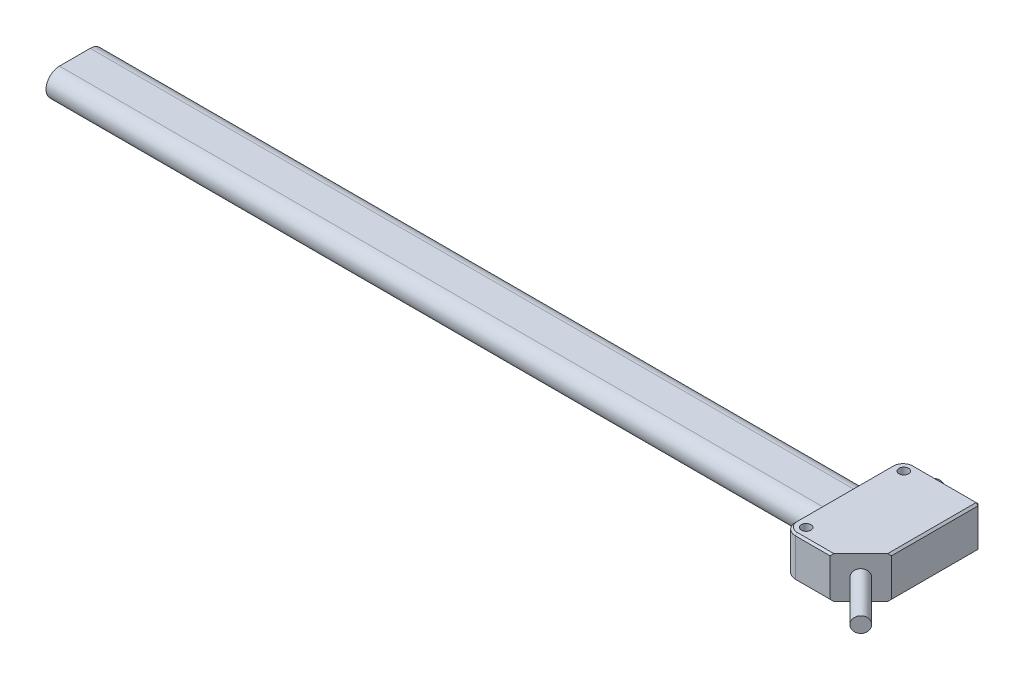
ISO-10303-21;
HEADER;
FILE_DESCRIPTION(('STEP AP214'),'2;1');
FILE_NAME('part.step','',(''),(''),'','','');
FILE_SCHEMA(('AUTOMOTIVE_DESIGN { 1 0 10303 214 1 1 1 1 }'));
ENDSEC;
DATA;
#1=APPLICATION_CONTEXT('core data for automotive mechanical design processes');
#2=APPLICATION_PROTOCOL_DEFINITION('international standard','automotive_design',2000,#1);
#3=PRODUCT_CONTEXT('',#1,'mechanical');
#4=PRODUCT('Part','Part','',(#3));
#5=PRODUCT_RELATED_PRODUCT_CATEGORY('part','',(#4));
#6=PRODUCT_DEFINITION_FORMATION('','',#4);
#7=PRODUCT_DEFINITION_CONTEXT('part definition',#1,'design');
#8=PRODUCT_DEFINITION('design','',#6,#7);
#9=PRODUCT_DEFINITION_SHAPE('','',#8);
#10=(LENGTH_UNIT() NAMED_UNIT(*) SI_UNIT(.MILLI.,.METRE.));
#11=(NAMED_UNIT(*) PLANE_ANGLE_UNIT() SI_UNIT($,.RADIAN.));
#12=(NAMED_UNIT(*) SI_UNIT($,.STERADIAN.) SOLID_ANGLE_UNIT());
#13=UNCERTAINTY_MEASURE_WITH_UNIT(LENGTH_MEASURE(1.E-05),#10,'distance_accuracy_value','');
#14=(GEOMETRIC_REPRESENTATION_CONTEXT(3) GLOBAL_UNCERTAINTY_ASSIGNED_CONTEXT((#13)) GLOBAL_UNIT_ASSIGNED_CONTEXT((#10,
#11,#12)) REPRESENTATION_CONTEXT('',''));
#15=CARTESIAN_POINT('',(0.,0.,0.));
#16=DIRECTION('',(0.,0.,1.));
#17=DIRECTION('',(1.,0.,0.));
#18=AXIS2_PLACEMENT_3D('',#15,#16,#17);
#19=CARTESIAN_POINT('',(-200.,0.,19.5));
#20=DIRECTION('',(1.,0.,0.));
#21=DIRECTION('',(0.,0.,-1.));
#22=AXIS2_PLACEMENT_3D('',#19,#20,#21);
#23=CYLINDRICAL_SURFACE('',#22,3.5);
#24=CARTESIAN_POINT('',(0.,0.,19.5));
#25=DIRECTION('',(-1.,0.,0.));
#26=DIRECTION('',(0.,0.,1.));
#27=AXIS2_PLACEMENT_3D('',#24,#25,#26);
#28=CIRCLE('',#27,3.5);
#29=CARTESIAN_POINT('',(0.,-3.5,19.5));
#30=VERTEX_POINT('',#29);
#31=CARTESIAN_POINT('',(0.,3.5,19.5));
#32=VERTEX_POINT('',#31);
#33=EDGE_CURVE('E280',#30,#32,#28,.T.);
#34=ORIENTED_EDGE('',*,*,#33,.T.);
#35=DIRECTION('',(1.,0.,0.));
#36=VECTOR('',#35,1.);
#37=CARTESIAN_POINT('',(-200.,3.5,19.5));
#38=LINE('',#37,#36);
#39=CARTESIAN_POINT('',(-200.,3.5,19.5));
#40=VERTEX_POINT('',#39);
#41=EDGE_CURVE('E14',#40,#32,#38,.T.);
#42=ORIENTED_EDGE('',*,*,#41,.F.);
#43=CARTESIAN_POINT('',(-200.,0.,19.5));
#44=DIRECTION('',(-1.,0.,0.));
#45=DIRECTION('',(0.,0.,1.));
#46=AXIS2_PLACEMENT_3D('',#43,#44,#45);
#47=CIRCLE('',#46,3.5);
#48=CARTESIAN_POINT('',(-200.,-3.5,19.5));
#49=VERTEX_POINT('',#48);
#50=EDGE_CURVE('E264',#49,#40,#47,.T.);
#51=ORIENTED_EDGE('',*,*,#50,.F.);
#52=DIRECTION('',(1.,0.,0.));
#53=VECTOR('',#52,1.);
#54=CARTESIAN_POINT('',(-200.,-3.5,19.5));
#55=LINE('',#54,#53);
#56=EDGE_CURVE('E276',#49,#30,#55,.T.);
#57=ORIENTED_EDGE('',*,*,#56,.T.);
#58=EDGE_LOOP('',(#34,#42,#51,#57));
#59=FACE_BOUND('',#58,.T.);
#60=ADVANCED_FACE('F212',(#59),#23,.T.);
#61=CARTESIAN_POINT('',(-200.,3.5,19.5));
#62=DIRECTION('',(0.,-1.,0.));
#63=DIRECTION('',(0.,0.,-1.));
#64=AXIS2_PLACEMENT_3D('',#61,#62,#63);
#65=PLANE('',#64);
#66=DIRECTION('',(0.,0.,-1.));
#67=VECTOR('',#66,1.);
#68=CARTESIAN_POINT('',(0.,3.5,19.5));
#69=LINE('',#68,#67);
#70=CARTESIAN_POINT('',(0.,3.5,11.5));
#71=VERTEX_POINT('',#70);
#72=EDGE_CURVE('E269',#32,#71,#69,.T.);
#73=ORIENTED_EDGE('',*,*,#72,.T.);
#74=DIRECTION('',(1.,0.,0.));
#75=VECTOR('',#74,1.);
#76=CARTESIAN_POINT('',(-200.,3.5,11.5));
#77=LINE('',#76,#75);
#78=CARTESIAN_POINT('',(-200.,3.5,11.5));
#79=VERTEX_POINT('',#78);
#80=EDGE_CURVE('E221',#79,#71,#77,.T.);
#81=ORIENTED_EDGE('',*,*,#80,.F.);
#82=DIRECTION('',(0.,0.,-1.));
#83=VECTOR('',#82,1.);
#84=CARTESIAN_POINT('',(-200.,3.5,19.5));
#85=LINE('',#84,#83);
#86=EDGE_CURVE('E259',#40,#79,#85,.T.);
#87=ORIENTED_EDGE('',*,*,#86,.F.);
#88=ORIENTED_EDGE('',*,*,#41,.T.);
#89=EDGE_LOOP('',(#73,#81,#87,#88));
#90=FACE_BOUND('',#89,.T.);
#91=ADVANCED_FACE('F268',(#90),#65,.F.);
#92=CARTESIAN_POINT('',(-200.,0.,11.5));
#93=DIRECTION('',(1.,0.,0.));
#94=DIRECTION('',(0.,0.,-1.));
#95=AXIS2_PLACEMENT_3D('',#92,#93,#94);
#96=CYLINDRICAL_SURFACE('',#95,3.5);
#97=CARTESIAN_POINT('',(0.,0.,11.5));
#98=DIRECTION('',(-1.,0.,0.));
#99=DIRECTION('',(0.,0.,1.));
#100=AXIS2_PLACEMENT_3D('',#97,#98,#99);
#101=CIRCLE('',#100,3.5);
#102=CARTESIAN_POINT('',(0.,-3.5,11.5));
#103=VERTEX_POINT('',#102);
#104=EDGE_CURVE('E246',#71,#103,#101,.T.);
#105=ORIENTED_EDGE('',*,*,#104,.T.);
#106=DIRECTION('',(1.,0.,0.));
#107=VECTOR('',#106,1.);
#108=CARTESIAN_POINT('',(-200.,-3.5,11.5));
#109=LINE('',#108,#107);
#110=CARTESIAN_POINT('',(-200.,-3.5,11.5));
#111=VERTEX_POINT('',#110);
#112=EDGE_CURVE('E271',#111,#103,#109,.T.);
#113=ORIENTED_EDGE('',*,*,#112,.F.);
#114=CARTESIAN_POINT('',(-200.,0.,11.5));
#115=DIRECTION('',(-1.,0.,0.));
#116=DIRECTION('',(0.,0.,1.));
#117=AXIS2_PLACEMENT_3D('',#114,#115,#116);
#118=CIRCLE('',#117,3.5);
#119=EDGE_CURVE('E262',#79,#111,#118,.T.);
#120=ORIENTED_EDGE('',*,*,#119,.F.);
#121=ORIENTED_EDGE('',*,*,#80,.T.);
#122=EDGE_LOOP('',(#105,#113,#120,#121));
#123=FACE_BOUND('',#122,.T.);
#124=ADVANCED_FACE('F272',(#123),#96,.T.);
#125=CARTESIAN_POINT('',(-200.,-3.5,11.5));
#126=DIRECTION('',(0.,1.,0.));
#127=DIRECTION('',(0.,0.,1.));
#128=AXIS2_PLACEMENT_3D('',#125,#126,#127);
#129=PLANE('',#128);
#130=DIRECTION('',(0.,0.,1.));
#131=VECTOR('',#130,1.);
#132=CARTESIAN_POINT('',(0.,-3.5,11.5));
#133=LINE('',#132,#131);
#134=EDGE_CURVE('E252',#103,#30,#133,.T.);
#135=ORIENTED_EDGE('',*,*,#134,.T.);
#136=ORIENTED_EDGE('',*,*,#56,.F.);
#137=DIRECTION('',(0.,0.,1.));
#138=VECTOR('',#137,1.);
#139=CARTESIAN_POINT('',(-200.,-3.5,11.5));
#140=LINE('',#139,#138);
#141=EDGE_CURVE('E229',#111,#49,#140,.T.);
#142=ORIENTED_EDGE('',*,*,#141,.F.);
#143=ORIENTED_EDGE('',*,*,#112,.T.);
#144=EDGE_LOOP('',(#135,#136,#142,#143));
#145=FACE_BOUND('',#144,.T.);
#146=ADVANCED_FACE('F293',(#145),#129,.F.);
#147=CARTESIAN_POINT('',(-200.,0.,19.5));
#148=DIRECTION('',(-1.,0.,0.));
#149=DIRECTION('',(0.,0.,1.));
#150=AXIS2_PLACEMENT_3D('',#147,#148,#149);
#151=PLANE('',#150);
#152=ORIENTED_EDGE('',*,*,#50,.T.);
#153=ORIENTED_EDGE('',*,*,#86,.T.);
#154=ORIENTED_EDGE('',*,*,#119,.T.);
#155=ORIENTED_EDGE('',*,*,#141,.T.);
#156=EDGE_LOOP('',(#152,#153,#154,#155));
#157=FACE_BOUND('',#156,.T.);
#158=ADVANCED_FACE('F260',(#157),#151,.T.);
#159=CARTESIAN_POINT('',(0.,0.,19.5));
#160=DIRECTION('',(-1.,0.,0.));
#161=DIRECTION('',(0.,0.,1.));
#162=AXIS2_PLACEMENT_3D('',#159,#160,#161);
#163=PLANE('',#162);
#164=ORIENTED_EDGE('',*,*,#33,.F.);
#165=ORIENTED_EDGE('',*,*,#134,.F.);
#166=ORIENTED_EDGE('',*,*,#104,.F.);
#167=ORIENTED_EDGE('',*,*,#72,.F.);
#168=EDGE_LOOP('',(#164,#165,#166,#167));
#169=FACE_BOUND('',#168,.T.);
#170=ADVANCED_FACE('F296',(#169),#163,.F.);
#171=CLOSED_SHELL('',(#60,#91,#124,#146,#158,#170));
#172=MANIFOLD_SOLID_BREP('B2',#171);
#173=CARTESIAN_POINT('',(0.,5.4,0.));
#174=DIRECTION('',(1.,0.,0.));
#175=DIRECTION('',(0.,0.,-1.));
#176=AXIS2_PLACEMENT_3D('',#173,#174,#175);
#177=PLANE('',#176);
#178=DIRECTION('',(0.,0.,-1.));
#179=VECTOR('',#178,1.);
#180=CARTESIAN_POINT('',(0.,3.5,11.5));
#181=LINE('',#180,#179);
#182=CARTESIAN_POINT('',(0.,3.5,19.5));
#183=VERTEX_POINT('',#182);
#184=CARTESIAN_POINT('',(0.,3.5,11.5));
#185=VERTEX_POINT('',#184);
#186=EDGE_CURVE('E523',#183,#185,#181,.T.);
#187=ORIENTED_EDGE('',*,*,#186,.T.);
#188=CARTESIAN_POINT('',(0.,0.,11.5));
#189=DIRECTION('',(1.,0.,0.));
#190=DIRECTION('',(0.,0.,-1.));
#191=AXIS2_PLACEMENT_3D('',#188,#189,#190);
#192=CIRCLE('',#191,3.5);
#193=CARTESIAN_POINT('',(0.,-3.5,11.5));
#194=VERTEX_POINT('',#193);
#195=EDGE_CURVE('E533',#185,#194,#192,.F.);
#196=ORIENTED_EDGE('',*,*,#195,.T.);
#197=DIRECTION('',(0.,0.,1.));
#198=VECTOR('',#197,1.);
#199=CARTESIAN_POINT('',(0.,-3.5,11.5));
#200=LINE('',#199,#198);
#201=CARTESIAN_POINT('',(0.,-3.5,19.5));
#202=VERTEX_POINT('',#201);
#203=EDGE_CURVE('E530',#194,#202,#200,.T.);
#204=ORIENTED_EDGE('',*,*,#203,.T.);
#205=CARTESIAN_POINT('',(0.,0.,19.5));
#206=DIRECTION('',(1.,0.,0.));
#207=DIRECTION('',(0.,0.,-1.));
#208=AXIS2_PLACEMENT_3D('',#205,#206,#207);
#209=CIRCLE('',#208,3.5);
#210=EDGE_CURVE('E527',#202,#183,#209,.F.);
#211=ORIENTED_EDGE('',*,*,#210,.T.);
#212=EDGE_LOOP('',(#187,#196,#204,#211));
#213=FACE_BOUND('',#212,.T.);
#214=ADVANCED_FACE('F347',(#213),#177,.F.);
#215=CARTESIAN_POINT('',(0.,5.4,0.));
#216=DIRECTION('',(0.,0.,1.));
#217=DIRECTION('',(1.,0.,0.));
#218=AXIS2_PLACEMENT_3D('',#215,#216,#217);
#219=PLANE('',#218);
#220=DIRECTION('',(0.,-1.,0.));
#221=VECTOR('',#220,1.);
#222=CARTESIAN_POINT('',(19.5,5.4,0.));
#223=LINE('',#222,#221);
#224=CARTESIAN_POINT('',(19.5,4.9,0.));
#225=VERTEX_POINT('',#224);
#226=CARTESIAN_POINT('',(19.5,-4.9,0.));
#227=VERTEX_POINT('',#226);
#228=EDGE_CURVE('E356',#225,#227,#223,.T.);
#229=ORIENTED_EDGE('',*,*,#228,.T.);
#230=DIRECTION('',(-1.,0.,0.));
#231=VECTOR('',#230,1.);
#232=CARTESIAN_POINT('',(0.,-4.9,0.));
#233=LINE('',#232,#231);
#234=CARTESIAN_POINT('',(3.,-4.9,0.));
#235=VERTEX_POINT('',#234);
#236=EDGE_CURVE('E210',#227,#235,#233,.T.);
#237=ORIENTED_EDGE('',*,*,#236,.T.);
#238=DIRECTION('',(0.,-1.,0.));
#239=VECTOR('',#238,1.);
#240=CARTESIAN_POINT('',(3.,5.4,0.));
#241=LINE('',#240,#239);
#242=CARTESIAN_POINT('',(3.,4.9,0.));
#243=VERTEX_POINT('',#242);
#244=EDGE_CURVE('E546',#235,#243,#241,.F.);
#245=ORIENTED_EDGE('',*,*,#244,.T.);
#246=DIRECTION('',(1.,0.,0.));
#247=VECTOR('',#246,1.);
#248=CARTESIAN_POINT('',(20.,4.9,0.));
#249=LINE('',#248,#247);
#250=EDGE_CURVE('E367',#243,#225,#249,.T.);
#251=ORIENTED_EDGE('',*,*,#250,.T.);
#252=EDGE_LOOP('',(#229,#237,#245,#251));
#253=FACE_BOUND('',#252,.T.);
#254=CARTESIAN_POINT('',(8.1,2.3,0.));
#255=DIRECTION('',(0.,0.,-1.));
#256=DIRECTION('',(-1.,0.,0.));
#257=AXIS2_PLACEMENT_3D('',#254,#255,#256);
#258=CIRCLE('',#257,2.1);
#259=CARTESIAN_POINT('',(6.,2.3,0.));
#260=VERTEX_POINT('',#259);
#261=CARTESIAN_POINT('',(10.2,2.3,0.));
#262=VERTEX_POINT('',#261);
#263=EDGE_CURVE('E484',#260,#262,#258,.T.);
#264=ORIENTED_EDGE('',*,*,#263,.F.);
#265=DIRECTION('',(0.,1.,0.));
#266=VECTOR('',#265,1.);
#267=CARTESIAN_POINT('',(6.,2.3,0.));
#268=LINE('',#267,#266);
#269=CARTESIAN_POINT('',(6.,-2.3,0.));
#270=VERTEX_POINT('',#269);
#271=EDGE_CURVE('E487',#270,#260,#268,.T.);
#272=ORIENTED_EDGE('',*,*,#271,.F.);
#273=CARTESIAN_POINT('',(8.1,-2.3,0.));
#274=DIRECTION('',(0.,0.,-1.));
#275=DIRECTION('',(-1.,0.,0.));
#276=AXIS2_PLACEMENT_3D('',#273,#274,#275);
#277=CIRCLE('',#276,2.1);
#278=CARTESIAN_POINT('',(10.2,-2.3,0.));
#279=VERTEX_POINT('',#278);
#280=EDGE_CURVE('E504',#279,#270,#277,.T.);
#281=ORIENTED_EDGE('',*,*,#280,.F.);
#282=DIRECTION('',(0.,-1.,0.));
#283=VECTOR('',#282,1.);
#284=CARTESIAN_POINT('',(10.2,2.3,0.));
#285=LINE('',#284,#283);
#286=EDGE_CURVE('E489',#262,#279,#285,.T.);
#287=ORIENTED_EDGE('',*,*,#286,.F.);
#288=EDGE_LOOP('',(#264,#272,#281,#287));
#289=FACE_BOUND('',#288,.T.);
#290=ADVANCED_FACE('F486',(#253,#289),#219,.F.);
#291=ORIENTED_EDGE('',*,*,#195,.F.);
#292=ORIENTED_EDGE('',*,*,#186,.F.);
#293=ORIENTED_EDGE('',*,*,#210,.F.);
#294=ORIENTED_EDGE('',*,*,#203,.F.);
#295=EDGE_LOOP('',(#291,#292,#293,#294));
#296=FACE_BOUND('',#295,.T.);
#297=DIRECTION('',(0.,-1.,0.));
#298=VECTOR('',#297,1.);
#299=CARTESIAN_POINT('',(0.,5.4,3.));
#300=LINE('',#299,#298);
#301=CARTESIAN_POINT('',(0.,4.9,3.));
#302=VERTEX_POINT('',#301);
#303=CARTESIAN_POINT('',(0.,-4.9,3.));
#304=VERTEX_POINT('',#303);
#305=EDGE_CURVE('E540',#302,#304,#300,.T.);
#306=ORIENTED_EDGE('',*,*,#305,.T.);
#307=DIRECTION('',(0.,0.,1.));
#308=VECTOR('',#307,1.);
#309=CARTESIAN_POINT('',(0.,-4.9,0.));
#310=LINE('',#309,#308);
#311=CARTESIAN_POINT('',(0.,-4.9,28.));
#312=VERTEX_POINT('',#311);
#313=EDGE_CURVE('E591',#304,#312,#310,.T.);
#314=ORIENTED_EDGE('',*,*,#313,.T.);
#315=DIRECTION('',(0.,-1.,0.));
#316=VECTOR('',#315,1.);
#317=CARTESIAN_POINT('',(0.,5.4,28.));
#318=LINE('',#317,#316);
#319=CARTESIAN_POINT('',(0.,4.9,28.));
#320=VERTEX_POINT('',#319);
#321=EDGE_CURVE('E543',#312,#320,#318,.F.);
#322=ORIENTED_EDGE('',*,*,#321,.T.);
#323=DIRECTION('',(0.,0.,-1.));
#324=VECTOR('',#323,1.);
#325=CARTESIAN_POINT('',(0.,4.9,3.));
#326=LINE('',#325,#324);
#327=EDGE_CURVE('E589',#320,#302,#326,.T.);
#328=ORIENTED_EDGE('',*,*,#327,.T.);
#329=EDGE_LOOP('',(#306,#314,#322,#328));
#330=FACE_BOUND('',#329,.T.);
#331=ADVANCED_FACE('F698',(#296,#330),#177,.F.);
#332=CARTESIAN_POINT('',(0.,5.4,31.));
#333=DIRECTION('',(0.,0.,-1.));
#334=DIRECTION('',(-1.,0.,0.));
#335=AXIS2_PLACEMENT_3D('',#332,#333,#334);
#336=PLANE('',#335);
#337=DIRECTION('',(0.,-1.,0.));
#338=VECTOR('',#337,1.);
#339=CARTESIAN_POINT('',(3.,5.4,31.));
#340=LINE('',#339,#338);
#341=CARTESIAN_POINT('',(3.,4.9,31.));
#342=VERTEX_POINT('',#341);
#343=CARTESIAN_POINT('',(3.,-4.9,31.));
#344=VERTEX_POINT('',#343);
#345=EDGE_CURVE('E537',#342,#344,#340,.T.);
#346=ORIENTED_EDGE('',*,*,#345,.T.);
#347=DIRECTION('',(1.,0.,0.));
#348=VECTOR('',#347,1.);
#349=CARTESIAN_POINT('',(0.,-4.9,31.));
#350=LINE('',#349,#348);
#351=CARTESIAN_POINT('',(11.9999999999999,-4.9,31.));
#352=VERTEX_POINT('',#351);
#353=EDGE_CURVE('E550',#344,#352,#350,.T.);
#354=ORIENTED_EDGE('',*,*,#353,.T.);
#355=DIRECTION('',(0.,-1.,0.));
#356=VECTOR('',#355,1.);
#357=CARTESIAN_POINT('',(11.9999999999999,5.4,31.));
#358=LINE('',#357,#356);
#359=CARTESIAN_POINT('',(11.9999999999999,4.9,31.));
#360=VERTEX_POINT('',#359);
#361=EDGE_CURVE('E517',#360,#352,#358,.T.);
#362=ORIENTED_EDGE('',*,*,#361,.F.);
#363=DIRECTION('',(-1.,0.,0.));
#364=VECTOR('',#363,1.);
#365=CARTESIAN_POINT('',(3.,4.9,31.));
#366=LINE('',#365,#364);
#367=EDGE_CURVE('E548',#360,#342,#366,.T.);
#368=ORIENTED_EDGE('',*,*,#367,.T.);
#369=EDGE_LOOP('',(#346,#354,#362,#368));
#370=FACE_BOUND('',#369,.T.);
#371=ADVANCED_FACE('F687',(#370),#336,.F.);
#372=CARTESIAN_POINT('',(20.,5.4,23.));
#373=DIRECTION('',(-0.707106781186544,0.,-0.707106781186551));
#374=DIRECTION('',(-0.707106781186551,0.,0.707106781186544));
#375=AXIS2_PLACEMENT_3D('',#372,#373,#374);
#376=PLANE('',#375);
#377=CARTESIAN_POINT('',(16.,0.,27.));
#378=DIRECTION('',(0.707106781186544,0.,0.707106781186551));
#379=DIRECTION('',(0.707106781186551,0.,-0.707106781186544));
#380=AXIS2_PLACEMENT_3D('',#377,#378,#379);
#381=CIRCLE('',#380,2.);
#382=CARTESIAN_POINT('',(17.4142135623731,0.,25.5857864376269));
#383=VERTEX_POINT('',#382);
#384=EDGE_CURVE('E536',#383,#383,#381,.T.);
#385=ORIENTED_EDGE('',*,*,#384,.F.);
#386=EDGE_LOOP('',(#385));
#387=FACE_BOUND('',#386,.T.);
#388=ORIENTED_EDGE('',*,*,#361,.T.);
#389=DIRECTION('',(-0.57735026918963,0.577350269189624,0.577350269189624));
#390=VECTOR('',#389,1.);
#391=CARTESIAN_POINT('',(7.99999999999989,-0.900000000000012,35.));
#392=LINE('',#391,#390);
#393=CARTESIAN_POINT('',(12.4999999999999,-5.4,30.5));
#394=VERTEX_POINT('',#393);
#395=EDGE_CURVE('E559',#352,#394,#392,.F.);
#396=ORIENTED_EDGE('',*,*,#395,.T.);
#397=DIRECTION('',(0.707106781186551,0.,-0.707106781186544));
#398=VECTOR('',#397,1.);
#399=CARTESIAN_POINT('',(20.,-5.4,23.));
#400=LINE('',#399,#398);
#401=CARTESIAN_POINT('',(19.5,-5.4,23.5));
#402=VERTEX_POINT('',#401);
#403=EDGE_CURVE('E503',#394,#402,#400,.T.);
#404=ORIENTED_EDGE('',*,*,#403,.T.);
#405=DIRECTION('',(-0.577350269189626,-0.57735026918963,0.57735026918962));
#406=VECTOR('',#405,1.);
#407=CARTESIAN_POINT('',(27.6666666666666,2.76666666666666,15.3333333333335));
#408=LINE('',#407,#406);
#409=CARTESIAN_POINT('',(20.,-4.9,23.));
#410=VERTEX_POINT('',#409);
#411=EDGE_CURVE('E555',#402,#410,#408,.F.);
#412=ORIENTED_EDGE('',*,*,#411,.T.);
#413=DIRECTION('',(0.,-1.,0.));
#414=VECTOR('',#413,1.);
#415=CARTESIAN_POINT('',(20.,5.4,23.));
#416=LINE('',#415,#414);
#417=CARTESIAN_POINT('',(20.,4.9,23.));
#418=VERTEX_POINT('',#417);
#419=EDGE_CURVE('E672',#418,#410,#416,.T.);
#420=ORIENTED_EDGE('',*,*,#419,.F.);
#421=DIRECTION('',(-0.577350269189626,0.57735026918963,0.57735026918962));
#422=VECTOR('',#421,1.);
#423=CARTESIAN_POINT('',(27.3333333333333,-2.43333333333332,15.6666666666668));
#424=LINE('',#423,#422);
#425=CARTESIAN_POINT('',(19.5,5.4,23.5));
#426=VERTEX_POINT('',#425);
#427=EDGE_CURVE('E553',#418,#426,#424,.T.);
#428=ORIENTED_EDGE('',*,*,#427,.T.);
#429=DIRECTION('',(0.707106781186551,0.,-0.707106781186544));
#430=VECTOR('',#429,1.);
#431=CARTESIAN_POINT('',(20.,5.4,23.));
#432=LINE('',#431,#430);
#433=CARTESIAN_POINT('',(12.4999999999999,5.4,30.5));
#434=VERTEX_POINT('',#433);
#435=EDGE_CURVE('E669',#434,#426,#432,.T.);
#436=ORIENTED_EDGE('',*,*,#435,.F.);
#437=DIRECTION('',(-0.57735026918963,-0.577350269189624,0.577350269189624));
#438=VECTOR('',#437,1.);
#439=CARTESIAN_POINT('',(8.33333333333323,1.23333333333334,34.6666666666667));
#440=LINE('',#439,#438);
#441=EDGE_CURVE('E557',#434,#360,#440,.T.);
#442=ORIENTED_EDGE('',*,*,#441,.T.);
#443=EDGE_LOOP('',(#388,#396,#404,#412,#420,#428,#436,#442));
#444=FACE_BOUND('',#443,.T.);
#445=ADVANCED_FACE('F681',(#387,#444),#376,.F.);
#446=CARTESIAN_POINT('',(20.,5.4,0.));
#447=DIRECTION('',(-1.,0.,0.));
#448=DIRECTION('',(0.,0.,1.));
#449=AXIS2_PLACEMENT_3D('',#446,#447,#448);
#450=PLANE('',#449);
#451=ORIENTED_EDGE('',*,*,#419,.T.);
#452=DIRECTION('',(0.,0.,-1.));
#453=VECTOR('',#452,1.);
#454=CARTESIAN_POINT('',(20.,-4.9,0.));
#455=LINE('',#454,#453);
#456=CARTESIAN_POINT('',(20.,-4.9,0.5));
#457=VERTEX_POINT('',#456);
#458=EDGE_CURVE('E601',#410,#457,#455,.T.);
#459=ORIENTED_EDGE('',*,*,#458,.T.);
#460=DIRECTION('',(0.,1.,0.));
#461=VECTOR('',#460,1.);
#462=CARTESIAN_POINT('',(20.,5.4,0.5));
#463=LINE('',#462,#461);
#464=CARTESIAN_POINT('',(20.,4.9,0.5));
#465=VERTEX_POINT('',#464);
#466=EDGE_CURVE('E599',#457,#465,#463,.T.);
#467=ORIENTED_EDGE('',*,*,#466,.T.);
#468=DIRECTION('',(0.,0.,1.));
#469=VECTOR('',#468,1.);
#470=CARTESIAN_POINT('',(20.,4.9,23.));
#471=LINE('',#470,#469);
#472=EDGE_CURVE('E597',#465,#418,#471,.T.);
#473=ORIENTED_EDGE('',*,*,#472,.T.);
#474=EDGE_LOOP('',(#451,#459,#467,#473));
#475=FACE_BOUND('',#474,.T.);
#476=ADVANCED_FACE('F722',(#475),#450,.F.);
#477=CARTESIAN_POINT('',(0.,5.4,0.));
#478=DIRECTION('',(0.,1.,0.));
#479=DIRECTION('',(0.,0.,1.));
#480=AXIS2_PLACEMENT_3D('',#477,#478,#479);
#481=PLANE('',#480);
#482=CARTESIAN_POINT('',(3.,5.4,2.8));
#483=DIRECTION('',(0.,1.,0.));
#484=DIRECTION('',(0.,0.,1.));
#485=AXIS2_PLACEMENT_3D('',#482,#483,#484);
#486=CIRCLE('',#485,1.24999999999999);
#487=CARTESIAN_POINT('',(3.,5.4,4.04999999999999));
#488=VERTEX_POINT('',#487);
#489=EDGE_CURVE('E653',#488,#488,#486,.T.);
#490=ORIENTED_EDGE('',*,*,#489,.F.);
#491=EDGE_LOOP('',(#490));
#492=FACE_BOUND('',#491,.T.);
#493=CARTESIAN_POINT('',(3.,5.4,28.2));
#494=DIRECTION('',(0.,1.,0.));
#495=DIRECTION('',(0.,0.,1.));
#496=AXIS2_PLACEMENT_3D('',#493,#494,#495);
#497=CIRCLE('',#496,1.24999999999999);
#498=CARTESIAN_POINT('',(3.,5.4,29.45));
#499=VERTEX_POINT('',#498);
#500=EDGE_CURVE('E514',#499,#499,#497,.T.);
#501=ORIENTED_EDGE('',*,*,#500,.F.);
#502=EDGE_LOOP('',(#501));
#503=FACE_BOUND('',#502,.T.);
#504=CARTESIAN_POINT('',(3.,5.4,28.));
#505=DIRECTION('',(0.,1.,0.));
#506=DIRECTION('',(0.,0.,1.));
#507=AXIS2_PLACEMENT_3D('',#504,#505,#506);
#508=CIRCLE('',#507,2.5);
#509=CARTESIAN_POINT('',(0.5,5.4,28.));
#510=VERTEX_POINT('',#509);
#511=CARTESIAN_POINT('',(3.,5.4,30.5));
#512=VERTEX_POINT('',#511);
#513=EDGE_CURVE('E581',#510,#512,#508,.T.);
#514=ORIENTED_EDGE('',*,*,#513,.T.);
#515=DIRECTION('',(1.,0.,0.));
#516=VECTOR('',#515,1.);
#517=CARTESIAN_POINT('',(11.9999999999999,5.4,30.5));
#518=LINE('',#517,#516);
#519=EDGE_CURVE('E583',#512,#434,#518,.T.);
#520=ORIENTED_EDGE('',*,*,#519,.T.);
#521=ORIENTED_EDGE('',*,*,#435,.T.);
#522=DIRECTION('',(0.,0.,-1.));
#523=VECTOR('',#522,1.);
#524=CARTESIAN_POINT('',(19.5,5.4,0.));
#525=LINE('',#524,#523);
#526=CARTESIAN_POINT('',(19.5,5.4,0.5));
#527=VERTEX_POINT('',#526);
#528=EDGE_CURVE('E575',#426,#527,#525,.T.);
#529=ORIENTED_EDGE('',*,*,#528,.T.);
#530=DIRECTION('',(-1.,0.,0.));
#531=VECTOR('',#530,1.);
#532=CARTESIAN_POINT('',(3.,5.4,0.5));
#533=LINE('',#532,#531);
#534=CARTESIAN_POINT('',(3.,5.4,0.5));
#535=VERTEX_POINT('',#534);
#536=EDGE_CURVE('E573',#527,#535,#533,.T.);
#537=ORIENTED_EDGE('',*,*,#536,.T.);
#538=CARTESIAN_POINT('',(3.,5.4,3.));
#539=DIRECTION('',(0.,1.,0.));
#540=DIRECTION('',(0.,0.,1.));
#541=AXIS2_PLACEMENT_3D('',#538,#539,#540);
#542=CIRCLE('',#541,2.5);
#543=CARTESIAN_POINT('',(0.5,5.4,3.));
#544=VERTEX_POINT('',#543);
#545=EDGE_CURVE('E577',#535,#544,#542,.T.);
#546=ORIENTED_EDGE('',*,*,#545,.T.);
#547=DIRECTION('',(0.,0.,1.));
#548=VECTOR('',#547,1.);
#549=CARTESIAN_POINT('',(0.5,5.4,28.));
#550=LINE('',#549,#548);
#551=EDGE_CURVE('E579',#544,#510,#550,.T.);
#552=ORIENTED_EDGE('',*,*,#551,.T.);
#553=EDGE_LOOP('',(#514,#520,#521,#529,#537,#546,#552));
#554=FACE_BOUND('',#553,.T.);
#555=ADVANCED_FACE('F736',(#492,#503,#554),#481,.T.);
#556=CARTESIAN_POINT('',(0.,-5.4,0.));
#557=DIRECTION('',(0.,1.,0.));
#558=DIRECTION('',(0.,0.,1.));
#559=AXIS2_PLACEMENT_3D('',#556,#557,#558);
#560=PLANE('',#559);
#561=ORIENTED_EDGE('',*,*,#403,.F.);
#562=DIRECTION('',(-1.,0.,0.));
#563=VECTOR('',#562,1.);
#564=CARTESIAN_POINT('',(0.,-5.4,30.5));
#565=LINE('',#564,#563);
#566=CARTESIAN_POINT('',(3.,-5.4,30.5));
#567=VERTEX_POINT('',#566);
#568=EDGE_CURVE('E571',#394,#567,#565,.T.);
#569=ORIENTED_EDGE('',*,*,#568,.T.);
#570=CARTESIAN_POINT('',(3.,-5.4,28.));
#571=DIRECTION('',(0.,1.,0.));
#572=DIRECTION('',(0.,0.,1.));
#573=AXIS2_PLACEMENT_3D('',#570,#571,#572);
#574=CIRCLE('',#573,2.5);
#575=CARTESIAN_POINT('',(0.5,-5.4,28.));
#576=VERTEX_POINT('',#575);
#577=EDGE_CURVE('E569',#567,#576,#574,.F.);
#578=ORIENTED_EDGE('',*,*,#577,.T.);
#579=DIRECTION('',(0.,0.,-1.));
#580=VECTOR('',#579,1.);
#581=CARTESIAN_POINT('',(0.5,-5.4,0.));
#582=LINE('',#581,#580);
#583=CARTESIAN_POINT('',(0.5,-5.4,3.));
#584=VERTEX_POINT('',#583);
#585=EDGE_CURVE('E567',#576,#584,#582,.T.);
#586=ORIENTED_EDGE('',*,*,#585,.T.);
#587=CARTESIAN_POINT('',(3.,-5.4,3.));
#588=DIRECTION('',(0.,1.,0.));
#589=DIRECTION('',(0.,0.,1.));
#590=AXIS2_PLACEMENT_3D('',#587,#588,#589);
#591=CIRCLE('',#590,2.5);
#592=CARTESIAN_POINT('',(3.,-5.4,0.5));
#593=VERTEX_POINT('',#592);
#594=EDGE_CURVE('E565',#584,#593,#591,.F.);
#595=ORIENTED_EDGE('',*,*,#594,.T.);
#596=DIRECTION('',(1.,0.,0.));
#597=VECTOR('',#596,1.);
#598=CARTESIAN_POINT('',(0.,-5.4,0.5));
#599=LINE('',#598,#597);
#600=CARTESIAN_POINT('',(19.5,-5.4,0.5));
#601=VERTEX_POINT('',#600);
#602=EDGE_CURVE('E561',#593,#601,#599,.T.);
#603=ORIENTED_EDGE('',*,*,#602,.T.);
#604=DIRECTION('',(0.,0.,1.));
#605=VECTOR('',#604,1.);
#606=CARTESIAN_POINT('',(19.5,-5.4,0.));
#607=LINE('',#606,#605);
#608=EDGE_CURVE('E563',#601,#402,#607,.T.);
#609=ORIENTED_EDGE('',*,*,#608,.T.);
#610=EDGE_LOOP('',(#561,#569,#578,#586,#595,#603,#609));
#611=FACE_BOUND('',#610,.T.);
#612=CARTESIAN_POINT('',(3.,-5.4,2.8));
#613=DIRECTION('',(0.,1.,0.));
#614=DIRECTION('',(0.,0.,1.));
#615=AXIS2_PLACEMENT_3D('',#612,#613,#614);
#616=CIRCLE('',#615,1.25);
#617=CARTESIAN_POINT('',(3.,-5.4,4.05));
#618=VERTEX_POINT('',#617);
#619=EDGE_CURVE('E658',#618,#618,#616,.T.);
#620=ORIENTED_EDGE('',*,*,#619,.T.);
#621=EDGE_LOOP('',(#620));
#622=FACE_BOUND('',#621,.T.);
#623=CARTESIAN_POINT('',(3.,-5.4,28.2));
#624=DIRECTION('',(0.,1.,0.));
#625=DIRECTION('',(0.,0.,1.));
#626=AXIS2_PLACEMENT_3D('',#623,#624,#625);
#627=CIRCLE('',#626,1.25);
#628=CARTESIAN_POINT('',(3.,-5.4,29.45));
#629=VERTEX_POINT('',#628);
#630=EDGE_CURVE('E510',#629,#629,#627,.T.);
#631=ORIENTED_EDGE('',*,*,#630,.T.);
#632=EDGE_LOOP('',(#631));
#633=FACE_BOUND('',#632,.T.);
#634=ADVANCED_FACE('F714',(#611,#622,#633),#560,.F.);
#635=CARTESIAN_POINT('',(8.1,-2.3,0.));
#636=DIRECTION('',(0.,0.,-1.));
#637=DIRECTION('',(-1.,0.,0.));
#638=AXIS2_PLACEMENT_3D('',#635,#636,#637);
#639=SPHERICAL_SURFACE('',#638,2.1);
#640=CARTESIAN_POINT('',(8.1,-2.3,0.));
#641=DIRECTION('',(0.,1.,0.));
#642=DIRECTION('',(0.,0.,1.));
#643=AXIS2_PLACEMENT_3D('',#640,#641,#642);
#644=CIRCLE('',#643,2.1);
#645=CARTESIAN_POINT('',(8.1,-2.3,-2.1));
#646=VERTEX_POINT('',#645);
#647=EDGE_CURVE('E493',#279,#646,#644,.T.);
#648=ORIENTED_EDGE('',*,*,#647,.F.);
#649=ORIENTED_EDGE('',*,*,#280,.T.);
#650=CARTESIAN_POINT('',(8.1,-2.3,0.));
#651=DIRECTION('',(0.,1.,0.));
#652=DIRECTION('',(0.,0.,1.));
#653=AXIS2_PLACEMENT_3D('',#650,#651,#652);
#654=CIRCLE('',#653,2.1);
#655=EDGE_CURVE('E501',#646,#270,#654,.T.);
#656=ORIENTED_EDGE('',*,*,#655,.F.);
#657=EDGE_LOOP('',(#648,#649,#656));
#658=FACE_BOUND('',#657,.T.);
#659=ADVANCED_FACE('F793',(#658),#639,.T.);
#660=CARTESIAN_POINT('',(8.1,2.3,0.));
#661=DIRECTION('',(0.,1.,0.));
#662=DIRECTION('',(0.,0.,1.));
#663=AXIS2_PLACEMENT_3D('',#660,#661,#662);
#664=CYLINDRICAL_SURFACE('',#663,2.1);
#665=CARTESIAN_POINT('',(8.1,2.3,0.));
#666=DIRECTION('',(0.,1.,0.));
#667=DIRECTION('',(0.,0.,1.));
#668=AXIS2_PLACEMENT_3D('',#665,#666,#667);
#669=CIRCLE('',#668,2.1);
#670=CARTESIAN_POINT('',(8.1,2.3,-2.1));
#671=VERTEX_POINT('',#670);
#672=EDGE_CURVE('E507',#262,#671,#669,.T.);
#673=ORIENTED_EDGE('',*,*,#672,.F.);
#674=ORIENTED_EDGE('',*,*,#286,.T.);
#675=ORIENTED_EDGE('',*,*,#647,.T.);
#676=DIRECTION('',(0.,-1.,0.));
#677=VECTOR('',#676,1.);
#678=CARTESIAN_POINT('',(8.1,-2.3,-2.1));
#679=LINE('',#678,#677);
#680=EDGE_CURVE('E509',#671,#646,#679,.T.);
#681=ORIENTED_EDGE('',*,*,#680,.F.);
#682=EDGE_LOOP('',(#673,#674,#675,#681));
#683=FACE_BOUND('',#682,.T.);
#684=ADVANCED_FACE('F972',(#683),#664,.T.);
#685=CARTESIAN_POINT('',(8.1,2.3,0.));
#686=DIRECTION('',(0.,0.,-1.));
#687=DIRECTION('',(-1.,0.,0.));
#688=AXIS2_PLACEMENT_3D('',#685,#686,#687);
#689=SPHERICAL_SURFACE('',#688,2.1);
#690=ORIENTED_EDGE('',*,*,#263,.T.);
#691=ORIENTED_EDGE('',*,*,#672,.T.);
#692=CARTESIAN_POINT('',(8.1,2.3,0.));
#693=DIRECTION('',(0.,-1.,0.));
#694=DIRECTION('',(0.,0.,-1.));
#695=AXIS2_PLACEMENT_3D('',#692,#693,#694);
#696=CIRCLE('',#695,2.1);
#697=EDGE_CURVE('E499',#260,#671,#696,.T.);
#698=ORIENTED_EDGE('',*,*,#697,.F.);
#699=EDGE_LOOP('',(#690,#691,#698));
#700=FACE_BOUND('',#699,.T.);
#701=ADVANCED_FACE('F506',(#700),#689,.T.);
#702=CARTESIAN_POINT('',(8.1,2.3,0.));
#703=DIRECTION('',(0.,-1.,0.));
#704=DIRECTION('',(0.,0.,-1.));
#705=AXIS2_PLACEMENT_3D('',#702,#703,#704);
#706=CYLINDRICAL_SURFACE('',#705,2.1);
#707=ORIENTED_EDGE('',*,*,#655,.T.);
#708=ORIENTED_EDGE('',*,*,#271,.T.);
#709=ORIENTED_EDGE('',*,*,#697,.T.);
#710=ORIENTED_EDGE('',*,*,#680,.T.);
#711=EDGE_LOOP('',(#707,#708,#709,#710));
#712=FACE_BOUND('',#711,.T.);
#713=ADVANCED_FACE('F497',(#712),#706,.T.);
#714=CARTESIAN_POINT('',(3.,5.4,28.2));
#715=DIRECTION('',(0.,1.,0.));
#716=DIRECTION('',(0.,0.,1.));
#717=AXIS2_PLACEMENT_3D('',#714,#715,#716);
#718=CYLINDRICAL_SURFACE('',#717,1.24999999999999);
#719=ORIENTED_EDGE('',*,*,#630,.F.);
#720=EDGE_LOOP('',(#719));
#721=FACE_BOUND('',#720,.T.);
#722=ORIENTED_EDGE('',*,*,#500,.T.);
#723=EDGE_LOOP('',(#722));
#724=FACE_BOUND('',#723,.T.);
#725=ADVANCED_FACE('F797',(#721,#724),#718,.F.);
#726=CARTESIAN_POINT('',(3.,5.4,2.8));
#727=DIRECTION('',(0.,1.,0.));
#728=DIRECTION('',(0.,0.,1.));
#729=AXIS2_PLACEMENT_3D('',#726,#727,#728);
#730=CYLINDRICAL_SURFACE('',#729,1.24999999999999);
#731=ORIENTED_EDGE('',*,*,#619,.F.);
#732=EDGE_LOOP('',(#731));
#733=FACE_BOUND('',#732,.T.);
#734=ORIENTED_EDGE('',*,*,#489,.T.);
#735=EDGE_LOOP('',(#734));
#736=FACE_BOUND('',#735,.T.);
#737=ADVANCED_FACE('F800',(#733,#736),#730,.F.);
#738=CARTESIAN_POINT('',(26.6066017177981,0.,37.6066017177983));
#739=DIRECTION('',(-0.707106781186544,0.,-0.707106781186551));
#740=DIRECTION('',(-0.707106781186551,0.,0.707106781186544));
#741=AXIS2_PLACEMENT_3D('',#738,#739,#740);
#742=CYLINDRICAL_SURFACE('',#741,2.);
#743=CARTESIAN_POINT('',(26.6066017177981,0.,37.6066017177983));
#744=DIRECTION('',(0.707106781186544,0.,0.707106781186551));
#745=DIRECTION('',(0.707106781186551,0.,-0.707106781186544));
#746=AXIS2_PLACEMENT_3D('',#743,#744,#745);
#747=CIRCLE('',#746,2.);
#748=CARTESIAN_POINT('',(28.0208152801712,0.,36.1923881554252));
#749=VERTEX_POINT('',#748);
#750=EDGE_CURVE('E647',#749,#749,#747,.T.);
#751=ORIENTED_EDGE('',*,*,#750,.F.);
#752=EDGE_LOOP('',(#751));
#753=FACE_BOUND('',#752,.T.);
#754=ORIENTED_EDGE('',*,*,#384,.T.);
#755=EDGE_LOOP('',(#754));
#756=FACE_BOUND('',#755,.T.);
#757=ADVANCED_FACE('F804',(#753,#756),#742,.T.);
#758=CARTESIAN_POINT('',(26.6066017177981,0.,37.6066017177983));
#759=DIRECTION('',(0.707106781186544,0.,0.707106781186551));
#760=DIRECTION('',(0.707106781186551,0.,-0.707106781186544));
#761=AXIS2_PLACEMENT_3D('',#758,#759,#760);
#762=PLANE('',#761);
#763=ORIENTED_EDGE('',*,*,#750,.T.);
#764=EDGE_LOOP('',(#763));
#765=FACE_BOUND('',#764,.T.);
#766=ADVANCED_FACE('F808',(#765),#762,.T.);
#767=CARTESIAN_POINT('',(3.,5.4,28.));
#768=DIRECTION('',(0.,-1.,0.));
#769=DIRECTION('',(0.,0.,-1.));
#770=AXIS2_PLACEMENT_3D('',#767,#768,#769);
#771=CYLINDRICAL_SURFACE('',#770,3.);
#772=ORIENTED_EDGE('',*,*,#321,.F.);
#773=CARTESIAN_POINT('',(3.,-4.9,28.));
#774=DIRECTION('',(0.,1.,0.));
#775=DIRECTION('',(0.,0.,1.));
#776=AXIS2_PLACEMENT_3D('',#773,#774,#775);
#777=CIRCLE('',#776,3.);
#778=EDGE_CURVE('E587',#312,#344,#777,.T.);
#779=ORIENTED_EDGE('',*,*,#778,.T.);
#780=ORIENTED_EDGE('',*,*,#345,.F.);
#781=CARTESIAN_POINT('',(3.,4.9,28.));
#782=DIRECTION('',(0.,1.,0.));
#783=DIRECTION('',(0.,0.,1.));
#784=AXIS2_PLACEMENT_3D('',#781,#782,#783);
#785=CIRCLE('',#784,3.);
#786=EDGE_CURVE('E585',#342,#320,#785,.F.);
#787=ORIENTED_EDGE('',*,*,#786,.T.);
#788=EDGE_LOOP('',(#772,#779,#780,#787));
#789=FACE_BOUND('',#788,.T.);
#790=ADVANCED_FACE('F695',(#789),#771,.T.);
#791=CARTESIAN_POINT('',(3.,5.4,3.));
#792=DIRECTION('',(0.,-1.,0.));
#793=DIRECTION('',(0.,0.,-1.));
#794=AXIS2_PLACEMENT_3D('',#791,#792,#793);
#795=CYLINDRICAL_SURFACE('',#794,3.);
#796=ORIENTED_EDGE('',*,*,#244,.F.);
#797=CARTESIAN_POINT('',(3.,-4.9,3.));
#798=DIRECTION('',(0.,1.,0.));
#799=DIRECTION('',(0.,0.,1.));
#800=AXIS2_PLACEMENT_3D('',#797,#798,#799);
#801=CIRCLE('',#800,3.);
#802=EDGE_CURVE('E595',#235,#304,#801,.T.);
#803=ORIENTED_EDGE('',*,*,#802,.T.);
#804=ORIENTED_EDGE('',*,*,#305,.F.);
#805=CARTESIAN_POINT('',(3.,4.9,3.));
#806=DIRECTION('',(0.,1.,0.));
#807=DIRECTION('',(0.,0.,1.));
#808=AXIS2_PLACEMENT_3D('',#805,#806,#807);
#809=CIRCLE('',#808,3.);
#810=EDGE_CURVE('E593',#302,#243,#809,.F.);
#811=ORIENTED_EDGE('',*,*,#810,.T.);
#812=EDGE_LOOP('',(#796,#803,#804,#811));
#813=FACE_BOUND('',#812,.T.);
#814=ADVANCED_FACE('F747',(#813),#795,.T.);
#815=CARTESIAN_POINT('',(0.,5.4,30.5));
#816=DIRECTION('',(0.,0.707106781186547,0.707106781186547));
#817=DIRECTION('',(-1.,0.,0.));
#818=AXIS2_PLACEMENT_3D('',#815,#816,#817);
#819=PLANE('',#818);
#820=ORIENTED_EDGE('',*,*,#441,.F.);
#821=ORIENTED_EDGE('',*,*,#519,.F.);
#822=DIRECTION('',(0.,0.707106781186547,-0.707106781186547));
#823=VECTOR('',#822,1.);
#824=CARTESIAN_POINT('',(3.,4.9,31.));
#825=LINE('',#824,#823);
#826=EDGE_CURVE('E351',#342,#512,#825,.T.);
#827=ORIENTED_EDGE('',*,*,#826,.F.);
#828=ORIENTED_EDGE('',*,*,#367,.F.);
#829=EDGE_LOOP('',(#820,#821,#827,#828));
#830=FACE_BOUND('',#829,.T.);
#831=ADVANCED_FACE('F349',(#830),#819,.T.);
#832=CARTESIAN_POINT('',(3.,5.4,28.));
#833=DIRECTION('',(0.,-1.,0.));
#834=DIRECTION('',(0.,0.,-1.));
#835=AXIS2_PLACEMENT_3D('',#832,#833,#834);
#836=CONICAL_SURFACE('',#835,2.5,0.785398163397448);
#837=ORIENTED_EDGE('',*,*,#826,.T.);
#838=ORIENTED_EDGE('',*,*,#513,.F.);
#839=DIRECTION('',(0.707106781186548,0.707106781186547,0.));
#840=VECTOR('',#839,1.);
#841=CARTESIAN_POINT('',(0.,4.9,28.));
#842=LINE('',#841,#840);
#843=EDGE_CURVE('E640',#320,#510,#842,.T.);
#844=ORIENTED_EDGE('',*,*,#843,.F.);
#845=ORIENTED_EDGE('',*,*,#786,.F.);
#846=EDGE_LOOP('',(#837,#838,#844,#845));
#847=FACE_BOUND('',#846,.T.);
#848=ADVANCED_FACE('F692',(#847),#836,.T.);
#849=CARTESIAN_POINT('',(0.5,5.4,0.));
#850=DIRECTION('',(-0.707106781186548,0.707106781186547,0.));
#851=DIRECTION('',(0.,0.,-1.));
#852=AXIS2_PLACEMENT_3D('',#849,#850,#851);
#853=PLANE('',#852);
#854=ORIENTED_EDGE('',*,*,#843,.T.);
#855=ORIENTED_EDGE('',*,*,#551,.F.);
#856=DIRECTION('',(0.707106781186547,0.707106781186548,0.));
#857=VECTOR('',#856,1.);
#858=CARTESIAN_POINT('',(0.,4.9,3.));
#859=LINE('',#858,#857);
#860=EDGE_CURVE('E638',#302,#544,#859,.T.);
#861=ORIENTED_EDGE('',*,*,#860,.F.);
#862=ORIENTED_EDGE('',*,*,#327,.F.);
#863=EDGE_LOOP('',(#854,#855,#861,#862));
#864=FACE_BOUND('',#863,.T.);
#865=ADVANCED_FACE('F740',(#864),#853,.T.);
#866=CARTESIAN_POINT('',(3.,5.4,3.));
#867=DIRECTION('',(0.,-1.,0.));
#868=DIRECTION('',(0.,0.,-1.));
#869=AXIS2_PLACEMENT_3D('',#866,#867,#868);
#870=CONICAL_SURFACE('',#869,2.5,0.785398163397448);
#871=ORIENTED_EDGE('',*,*,#860,.T.);
#872=ORIENTED_EDGE('',*,*,#545,.F.);
#873=DIRECTION('',(0.,0.707106781186547,0.707106781186547));
#874=VECTOR('',#873,1.);
#875=CARTESIAN_POINT('',(3.,4.9,0.));
#876=LINE('',#875,#874);
#877=EDGE_CURVE('E635',#243,#535,#876,.T.);
#878=ORIENTED_EDGE('',*,*,#877,.F.);
#879=ORIENTED_EDGE('',*,*,#810,.F.);
#880=EDGE_LOOP('',(#871,#872,#878,#879));
#881=FACE_BOUND('',#880,.T.);
#882=ADVANCED_FACE('F743',(#881),#870,.T.);
#883=CARTESIAN_POINT('',(19.5,5.4,0.));
#884=DIRECTION('',(0.70710678118655,0.707106781186545,0.));
#885=DIRECTION('',(0.,0.,1.));
#886=AXIS2_PLACEMENT_3D('',#883,#884,#885);
#887=PLANE('',#886);
#888=ORIENTED_EDGE('',*,*,#427,.F.);
#889=ORIENTED_EDGE('',*,*,#472,.F.);
#890=DIRECTION('',(0.707106781186545,-0.70710678118655,0.));
#891=VECTOR('',#890,1.);
#892=CARTESIAN_POINT('',(20.,4.9,0.5));
#893=LINE('',#892,#891);
#894=EDGE_CURVE('E632',#527,#465,#893,.T.);
#895=ORIENTED_EDGE('',*,*,#894,.F.);
#896=ORIENTED_EDGE('',*,*,#528,.F.);
#897=EDGE_LOOP('',(#888,#889,#895,#896));
#898=FACE_BOUND('',#897,.T.);
#899=ADVANCED_FACE('F734',(#898),#887,.T.);
#900=CARTESIAN_POINT('',(0.,5.4,0.5));
#901=DIRECTION('',(0.,0.707106781186547,-0.707106781186548));
#902=DIRECTION('',(1.,0.,0.));
#903=AXIS2_PLACEMENT_3D('',#900,#901,#902);
#904=PLANE('',#903);
#905=ORIENTED_EDGE('',*,*,#877,.T.);
#906=ORIENTED_EDGE('',*,*,#536,.F.);
#907=DIRECTION('',(0.,0.707106781186548,0.707106781186547));
#908=VECTOR('',#907,1.);
#909=CARTESIAN_POINT('',(19.5,5.15,0.250000000000003));
#910=LINE('',#909,#908);
#911=EDGE_CURVE('E629',#225,#527,#910,.T.);
#912=ORIENTED_EDGE('',*,*,#911,.F.);
#913=ORIENTED_EDGE('',*,*,#250,.F.);
#914=EDGE_LOOP('',(#905,#906,#912,#913));
#915=FACE_BOUND('',#914,.T.);
#916=ADVANCED_FACE('F880',(#915),#904,.T.);
#917=CARTESIAN_POINT('',(20.,4.9,0.5));
#918=DIRECTION('',(0.577350269189625,0.577350269189622,-0.57735026918963));
#919=DIRECTION('',(-0.70710678118655,0.,-0.707106781186545));
#920=AXIS2_PLACEMENT_3D('',#917,#918,#919);
#921=PLANE('',#920);
#922=ORIENTED_EDGE('',*,*,#911,.T.);
#923=ORIENTED_EDGE('',*,*,#894,.T.);
#924=DIRECTION('',(0.70710678118655,0.,0.707106781186545));
#925=VECTOR('',#924,1.);
#926=CARTESIAN_POINT('',(20.,4.9,0.5));
#927=LINE('',#926,#925);
#928=EDGE_CURVE('E626',#225,#465,#927,.T.);
#929=ORIENTED_EDGE('',*,*,#928,.F.);
#930=EDGE_LOOP('',(#922,#923,#929));
#931=FACE_BOUND('',#930,.T.);
#932=ADVANCED_FACE('F729',(#931),#921,.T.);
#933=CARTESIAN_POINT('',(20.,-4.9,0.));
#934=DIRECTION('',(-0.70710678118655,0.707106781186545,0.));
#935=DIRECTION('',(0.,0.,-1.));
#936=AXIS2_PLACEMENT_3D('',#933,#934,#935);
#937=PLANE('',#936);
#938=ORIENTED_EDGE('',*,*,#411,.F.);
#939=ORIENTED_EDGE('',*,*,#608,.F.);
#940=DIRECTION('',(0.707106781186545,0.70710678118655,0.));
#941=VECTOR('',#940,1.);
#942=CARTESIAN_POINT('',(20.,-4.9,0.5));
#943=LINE('',#942,#941);
#944=EDGE_CURVE('E623',#457,#601,#943,.F.);
#945=ORIENTED_EDGE('',*,*,#944,.F.);
#946=ORIENTED_EDGE('',*,*,#458,.F.);
#947=EDGE_LOOP('',(#938,#939,#945,#946));
#948=FACE_BOUND('',#947,.T.);
#949=ADVANCED_FACE('F719',(#948),#937,.F.);
#950=CARTESIAN_POINT('',(19.5,5.4,0.));
#951=DIRECTION('',(-0.707106781186545,0.,0.70710678118655));
#952=DIRECTION('',(0.,-1.,0.));
#953=AXIS2_PLACEMENT_3D('',#950,#951,#952);
#954=PLANE('',#953);
#955=ORIENTED_EDGE('',*,*,#928,.T.);
#956=ORIENTED_EDGE('',*,*,#466,.F.);
#957=DIRECTION('',(-0.70710678118655,0.,-0.707106781186545));
#958=VECTOR('',#957,1.);
#959=CARTESIAN_POINT('',(20.,-4.9,0.5));
#960=LINE('',#959,#958);
#961=EDGE_CURVE('E620',#227,#457,#960,.F.);
#962=ORIENTED_EDGE('',*,*,#961,.F.);
#963=ORIENTED_EDGE('',*,*,#228,.F.);
#964=EDGE_LOOP('',(#955,#956,#962,#963));
#965=FACE_BOUND('',#964,.T.);
#966=ADVANCED_FACE('F725',(#965),#954,.F.);
#967=CARTESIAN_POINT('',(20.,-4.9,0.5));
#968=DIRECTION('',(0.577350269189625,-0.577350269189622,-0.57735026918963));
#969=DIRECTION('',(-0.70710678118655,0.,-0.707106781186545));
#970=AXIS2_PLACEMENT_3D('',#967,#968,#969);
#971=PLANE('',#970);
#972=ORIENTED_EDGE('',*,*,#961,.T.);
#973=ORIENTED_EDGE('',*,*,#944,.T.);
#974=DIRECTION('',(0.,-0.707106781186548,0.707106781186547));
#975=VECTOR('',#974,1.);
#976=CARTESIAN_POINT('',(19.5,-5.15,0.250000000000003));
#977=LINE('',#976,#975);
#978=EDGE_CURVE('E617',#227,#601,#977,.T.);
#979=ORIENTED_EDGE('',*,*,#978,.F.);
#980=EDGE_LOOP('',(#972,#973,#979));
#981=FACE_BOUND('',#980,.T.);
#982=ADVANCED_FACE('F764',(#981),#971,.T.);
#983=CARTESIAN_POINT('',(0.,-4.9,0.));
#984=DIRECTION('',(0.,0.707106781186547,0.707106781186548));
#985=DIRECTION('',(-1.,0.,0.));
#986=AXIS2_PLACEMENT_3D('',#983,#984,#985);
#987=PLANE('',#986);
#988=ORIENTED_EDGE('',*,*,#978,.T.);
#989=ORIENTED_EDGE('',*,*,#602,.F.);
#990=DIRECTION('',(0.,-0.707106781186548,0.707106781186547));
#991=VECTOR('',#990,1.);
#992=CARTESIAN_POINT('',(3.,-4.9,0.));
#993=LINE('',#992,#991);
#994=EDGE_CURVE('E614',#235,#593,#993,.T.);
#995=ORIENTED_EDGE('',*,*,#994,.F.);
#996=ORIENTED_EDGE('',*,*,#236,.F.);
#997=EDGE_LOOP('',(#988,#989,#995,#996));
#998=FACE_BOUND('',#997,.T.);
#999=ADVANCED_FACE('F751',(#998),#987,.F.);
#1000=CARTESIAN_POINT('',(3.,-5.4,3.));
#1001=DIRECTION('',(0.,1.,0.));
#1002=DIRECTION('',(0.,0.,1.));
#1003=AXIS2_PLACEMENT_3D('',#1000,#1001,#1002);
#1004=CONICAL_SURFACE('',#1003,2.5,0.785398163397448);
#1005=ORIENTED_EDGE('',*,*,#994,.T.);
#1006=ORIENTED_EDGE('',*,*,#594,.F.);
#1007=DIRECTION('',(0.707106781186548,-0.707106781186547,0.));
#1008=VECTOR('',#1007,1.);
#1009=CARTESIAN_POINT('',(0.,-4.9,3.));
#1010=LINE('',#1009,#1008);
#1011=EDGE_CURVE('E611',#304,#584,#1010,.T.);
#1012=ORIENTED_EDGE('',*,*,#1011,.F.);
#1013=ORIENTED_EDGE('',*,*,#802,.F.);
#1014=EDGE_LOOP('',(#1005,#1006,#1012,#1013));
#1015=FACE_BOUND('',#1014,.T.);
#1016=ADVANCED_FACE('F756',(#1015),#1004,.T.);
#1017=CARTESIAN_POINT('',(0.,-4.9,0.));
#1018=DIRECTION('',(0.707106781186548,0.707106781186547,0.));
#1019=DIRECTION('',(0.,0.,1.));
#1020=AXIS2_PLACEMENT_3D('',#1017,#1018,#1019);
#1021=PLANE('',#1020);
#1022=ORIENTED_EDGE('',*,*,#1011,.T.);
#1023=ORIENTED_EDGE('',*,*,#585,.F.);
#1024=DIRECTION('',(0.707106781186547,-0.707106781186548,0.));
#1025=VECTOR('',#1024,1.);
#1026=CARTESIAN_POINT('',(0.,-4.9,28.));
#1027=LINE('',#1026,#1025);
#1028=EDGE_CURVE('E608',#312,#576,#1027,.T.);
#1029=ORIENTED_EDGE('',*,*,#1028,.F.);
#1030=ORIENTED_EDGE('',*,*,#313,.F.);
#1031=EDGE_LOOP('',(#1022,#1023,#1029,#1030));
#1032=FACE_BOUND('',#1031,.T.);
#1033=ADVANCED_FACE('F703',(#1032),#1021,.F.);
#1034=CARTESIAN_POINT('',(3.,-5.4,28.));
#1035=DIRECTION('',(0.,1.,0.));
#1036=DIRECTION('',(0.,0.,1.));
#1037=AXIS2_PLACEMENT_3D('',#1034,#1035,#1036);
#1038=CONICAL_SURFACE('',#1037,2.5,0.785398163397448);
#1039=ORIENTED_EDGE('',*,*,#1028,.T.);
#1040=ORIENTED_EDGE('',*,*,#577,.F.);
#1041=DIRECTION('',(0.,-0.707106781186547,-0.707106781186547));
#1042=VECTOR('',#1041,1.);
#1043=CARTESIAN_POINT('',(3.,-4.9,31.));
#1044=LINE('',#1043,#1042);
#1045=EDGE_CURVE('E605',#344,#567,#1044,.T.);
#1046=ORIENTED_EDGE('',*,*,#1045,.F.);
#1047=ORIENTED_EDGE('',*,*,#778,.F.);
#1048=EDGE_LOOP('',(#1039,#1040,#1046,#1047));
#1049=FACE_BOUND('',#1048,.T.);
#1050=ADVANCED_FACE('F709',(#1049),#1038,.T.);
#1051=CARTESIAN_POINT('',(0.,-4.9,31.));
#1052=DIRECTION('',(0.,0.707106781186547,-0.707106781186547));
#1053=DIRECTION('',(1.,0.,0.));
#1054=AXIS2_PLACEMENT_3D('',#1051,#1052,#1053);
#1055=PLANE('',#1054);
#1056=ORIENTED_EDGE('',*,*,#1045,.T.);
#1057=ORIENTED_EDGE('',*,*,#568,.F.);
#1058=ORIENTED_EDGE('',*,*,#395,.F.);
#1059=ORIENTED_EDGE('',*,*,#353,.F.);
#1060=EDGE_LOOP('',(#1056,#1057,#1058,#1059));
#1061=FACE_BOUND('',#1060,.T.);
#1062=ADVANCED_FACE('F712',(#1061),#1055,.F.);
#1063=CLOSED_SHELL('',(#214,#290,#331,#371,#445,#476,#555,#634,#659,#684,#701,#713,#725,#737,
#757,#766,#790,#814,#831,#848,#865,#882,#899,#916,#932,#949,#966,#982,#999,#1016,#1033,#1050,#1062));
#1064=MANIFOLD_SOLID_BREP('B8',#1063);
#1065=ADVANCED_BREP_SHAPE_REPRESENTATION('',(#18,#172,#1064),#14);
#1066=SHAPE_DEFINITION_REPRESENTATION(#9,#1065);
ENDSEC;
END-ISO-10303-21;
